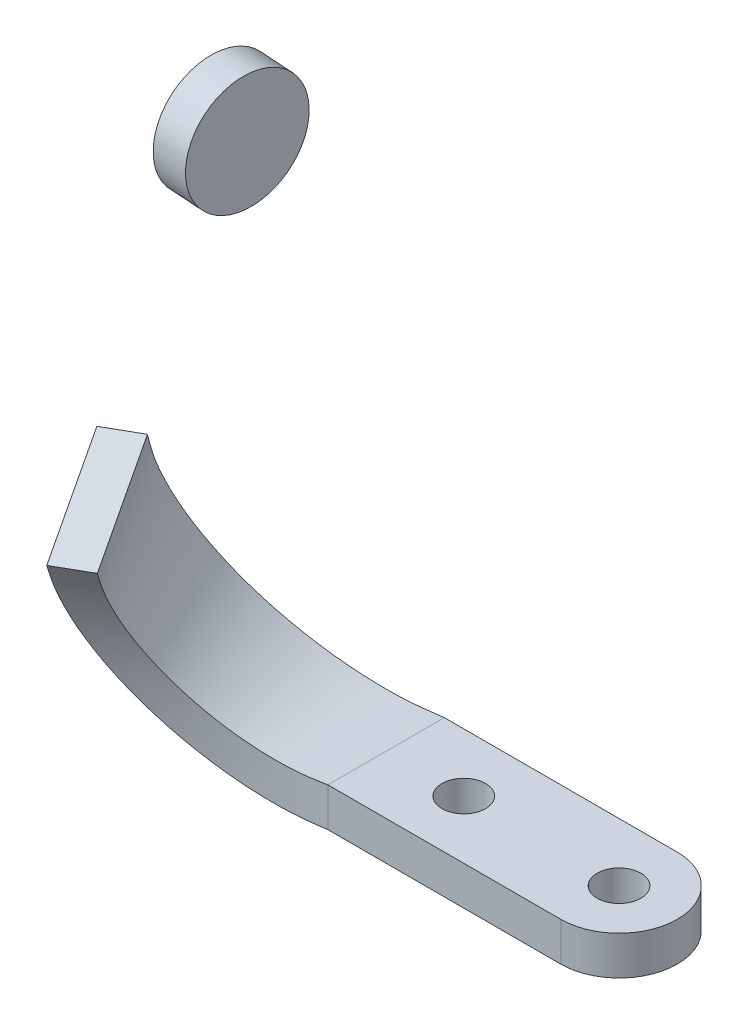
ISO-10303-21;
HEADER;
FILE_DESCRIPTION(('STEP AP214'),'2;1');
FILE_NAME('part.step','',(''),(''),'','','');
FILE_SCHEMA(('AUTOMOTIVE_DESIGN { 1 0 10303 214 1 1 1 1 }'));
ENDSEC;
DATA;
#1=APPLICATION_CONTEXT('core data for automotive mechanical design processes');
#2=APPLICATION_PROTOCOL_DEFINITION('international standard','automotive_design',2000,#1);
#3=PRODUCT_CONTEXT('',#1,'mechanical');
#4=PRODUCT('Part','Part','',(#3));
#5=PRODUCT_RELATED_PRODUCT_CATEGORY('part','',(#4));
#6=PRODUCT_DEFINITION_FORMATION('','',#4);
#7=PRODUCT_DEFINITION_CONTEXT('part definition',#1,'design');
#8=PRODUCT_DEFINITION('design','',#6,#7);
#9=PRODUCT_DEFINITION_SHAPE('','',#8);
#10=(LENGTH_UNIT() NAMED_UNIT(*) SI_UNIT(.MILLI.,.METRE.));
#11=(NAMED_UNIT(*) PLANE_ANGLE_UNIT() SI_UNIT($,.RADIAN.));
#12=(NAMED_UNIT(*) SI_UNIT($,.STERADIAN.) SOLID_ANGLE_UNIT());
#13=UNCERTAINTY_MEASURE_WITH_UNIT(LENGTH_MEASURE(1.E-05),#10,'distance_accuracy_value','');
#14=(GEOMETRIC_REPRESENTATION_CONTEXT(3) GLOBAL_UNCERTAINTY_ASSIGNED_CONTEXT((#13)) GLOBAL_UNIT_ASSIGNED_CONTEXT((#10,
#11,#12)) REPRESENTATION_CONTEXT('',''));
#15=CARTESIAN_POINT('',(0.,0.,0.));
#16=DIRECTION('',(0.,0.,1.));
#17=DIRECTION('',(1.,0.,0.));
#18=AXIS2_PLACEMENT_3D('',#15,#16,#17);
#19=CARTESIAN_POINT('',(16.9894171339197,88.6332155155401,-5.81435054927927));
#20=DIRECTION('',(0.997979380825055,0.,0.0635386138347371));
#21=DIRECTION('',(0.0635386138347371,0.,-0.997979380825055));
#22=AXIS2_PLACEMENT_3D('',#19,#20,#21);
#23=CYLINDRICAL_SURFACE('',#22,9.52500000652872);
#24=CARTESIAN_POINT('',(16.9894171339197,88.6332155155401,-5.81435054927927));
#25=DIRECTION('',(0.997979380825055,0.,0.0635386138347371));
#26=DIRECTION('',(0.0635386138347371,0.,-0.997979380825055));
#27=AXIS2_PLACEMENT_3D('',#24,#25,#26);
#28=CIRCLE('',#27,9.52500000652872);
#29=CARTESIAN_POINT('',(17.5946224311104,88.6332155155401,-15.3201041581534));
#30=VERTEX_POINT('',#29);
#31=EDGE_CURVE('E12',#30,#30,#28,.T.);
#32=ORIENTED_EDGE('',*,*,#31,.T.);
#33=EDGE_LOOP('',(#32));
#34=FACE_BOUND('',#33,.T.);
#35=CARTESIAN_POINT('',(22.6418391582322,88.6332155155401,-5.45447632027782));
#36=DIRECTION('',(0.997979380825055,0.,0.0635386138347371));
#37=DIRECTION('',(0.0635386138347371,0.,-0.997979380825055));
#38=AXIS2_PLACEMENT_3D('',#35,#36,#37);
#39=CIRCLE('',#38,9.52500000652872);
#40=CARTESIAN_POINT('',(23.2470444554229,88.6332155155401,-14.960229929152));
#41=VERTEX_POINT('',#40);
#42=EDGE_CURVE('E846',#41,#41,#39,.T.);
#43=ORIENTED_EDGE('',*,*,#42,.F.);
#44=EDGE_LOOP('',(#43));
#45=FACE_BOUND('',#44,.T.);
#46=ADVANCED_FACE('F843',(#34,#45),#23,.T.);
#47=CARTESIAN_POINT('',(16.552138930737,0.,1.05382935145369));
#48=DIRECTION('',(0.997979380825055,0.,0.0635386138347371));
#49=DIRECTION('',(0.0635386138347371,0.,-0.997979380825055));
#50=AXIS2_PLACEMENT_3D('',#47,#48,#49);
#51=PLANE('',#50);
#52=ORIENTED_EDGE('',*,*,#31,.F.);
#53=EDGE_LOOP('',(#52));
#54=FACE_BOUND('',#53,.T.);
#55=ADVANCED_FACE('F858',(#54),#51,.F.);
#56=CARTESIAN_POINT('',(22.2045609550496,0.,1.41370358045514));
#57=DIRECTION('',(0.997979380825055,0.,0.0635386138347371));
#58=DIRECTION('',(0.0635386138347371,0.,-0.997979380825055));
#59=AXIS2_PLACEMENT_3D('',#56,#57,#58);
#60=PLANE('',#59);
#61=ORIENTED_EDGE('',*,*,#42,.T.);
#62=EDGE_LOOP('',(#61));
#63=FACE_BOUND('',#62,.T.);
#64=ADVANCED_FACE('F855',(#63),#60,.T.);
#65=CLOSED_SHELL('',(#46,#55,#64));
#66=MANIFOLD_SOLID_BREP('B2',#65);
#67=CARTESIAN_POINT('',(88.9,19.05,0.));
#68=DIRECTION('',(0.,-1.,0.));
#69=DIRECTION('',(0.,0.,-1.));
#70=AXIS2_PLACEMENT_3D('',#67,#68,#69);
#71=CYLINDRICAL_SURFACE('',#70,9.52500000000001);
#72=CARTESIAN_POINT('',(88.9,12.7,0.));
#73=DIRECTION('',(0.,1.,0.));
#74=DIRECTION('',(0.,0.,1.));
#75=AXIS2_PLACEMENT_3D('',#72,#73,#74);
#76=CIRCLE('',#75,9.52500000000001);
#77=CARTESIAN_POINT('',(88.9,12.7,9.52499999999984));
#78=VERTEX_POINT('',#77);
#79=CARTESIAN_POINT('',(88.9,12.7,-9.52500000000292));
#80=VERTEX_POINT('',#79);
#81=EDGE_CURVE('E953',#78,#80,#76,.T.);
#82=ORIENTED_EDGE('',*,*,#81,.T.);
#83=DIRECTION('',(0.,-1.,0.));
#84=VECTOR('',#83,1.);
#85=CARTESIAN_POINT('',(88.9,19.05,-9.52500000000292));
#86=LINE('',#85,#84);
#87=CARTESIAN_POINT('',(88.9,19.05,-9.52500000000292));
#88=VERTEX_POINT('',#87);
#89=EDGE_CURVE('E841',#88,#80,#86,.T.);
#90=ORIENTED_EDGE('',*,*,#89,.F.);
#91=CARTESIAN_POINT('',(88.9,19.05,0.));
#92=DIRECTION('',(0.,1.,0.));
#93=DIRECTION('',(0.,0.,1.));
#94=AXIS2_PLACEMENT_3D('',#91,#92,#93);
#95=CIRCLE('',#94,9.52500000000001);
#96=CARTESIAN_POINT('',(88.9,19.05,9.52499999999984));
#97=VERTEX_POINT('',#96);
#98=EDGE_CURVE('E924',#97,#88,#95,.T.);
#99=ORIENTED_EDGE('',*,*,#98,.F.);
#100=DIRECTION('',(0.,-1.,0.));
#101=VECTOR('',#100,1.);
#102=CARTESIAN_POINT('',(88.9,19.05,9.52499999999984));
#103=LINE('',#102,#101);
#104=EDGE_CURVE('E1122',#97,#78,#103,.T.);
#105=ORIENTED_EDGE('',*,*,#104,.T.);
#106=EDGE_LOOP('',(#82,#90,#99,#105));
#107=FACE_BOUND('',#106,.T.);
#108=ADVANCED_FACE('F884',(#107),#71,.T.);
#109=CARTESIAN_POINT('',(0.,19.05,-9.52500000000583));
#110=DIRECTION('',(0.,0.,-1.));
#111=DIRECTION('',(-1.,0.,0.));
#112=AXIS2_PLACEMENT_3D('',#109,#110,#111);
#113=PLANE('',#112);
#114=DIRECTION('',(1.,0.,0.));
#115=VECTOR('',#114,1.);
#116=CARTESIAN_POINT('',(0.,12.7,-9.52500000000583));
#117=LINE('',#116,#115);
#118=CARTESIAN_POINT('',(50.8,12.7,-9.52500000000583));
#119=VERTEX_POINT('',#118);
#120=EDGE_CURVE('E943',#119,#80,#117,.T.);
#121=ORIENTED_EDGE('',*,*,#120,.F.);
#122=CARTESIAN_POINT('',(50.8,19.05,-9.52500000000583));
#123=CARTESIAN_POINT('',(50.8,12.7,-9.52500000000583));
#124=B_SPLINE_CURVE_WITH_KNOTS('',1,(#122,#123),.UNSPECIFIED.,.F.,.F.,(2,2),(0.,1.),.UNSPECIFIED.);
#125=CARTESIAN_POINT('',(50.8,19.05,-9.52500000000583));
#126=VERTEX_POINT('',#125);
#127=EDGE_CURVE('E893',#126,#119,#124,.T.);
#128=ORIENTED_EDGE('',*,*,#127,.F.);
#129=DIRECTION('',(1.,0.,0.));
#130=VECTOR('',#129,1.);
#131=CARTESIAN_POINT('',(0.,19.05,-9.52500000000583));
#132=LINE('',#131,#130);
#133=EDGE_CURVE('E1135',#126,#88,#132,.T.);
#134=ORIENTED_EDGE('',*,*,#133,.T.);
#135=ORIENTED_EDGE('',*,*,#89,.T.);
#136=EDGE_LOOP('',(#121,#128,#134,#135));
#137=FACE_BOUND('',#136,.T.);
#138=ADVANCED_FACE('F945',(#137),#113,.T.);
#139=CARTESIAN_POINT('',(0.,19.05,9.52499999999967));
#140=DIRECTION('',(0.,0.,-1.));
#141=DIRECTION('',(-1.,0.,0.));
#142=AXIS2_PLACEMENT_3D('',#139,#140,#141);
#143=PLANE('',#142);
#144=DIRECTION('',(1.,0.,0.));
#145=VECTOR('',#144,1.);
#146=CARTESIAN_POINT('',(0.,12.7,9.52499999999967));
#147=LINE('',#146,#145);
#148=CARTESIAN_POINT('',(50.8,12.7,9.52499999999967));
#149=VERTEX_POINT('',#148);
#150=EDGE_CURVE('E919',#149,#78,#147,.T.);
#151=ORIENTED_EDGE('',*,*,#150,.T.);
#152=ORIENTED_EDGE('',*,*,#104,.F.);
#153=DIRECTION('',(1.,0.,0.));
#154=VECTOR('',#153,1.);
#155=CARTESIAN_POINT('',(0.,19.05,9.52499999999967));
#156=LINE('',#155,#154);
#157=CARTESIAN_POINT('',(50.8,19.05,9.52499999999967));
#158=VERTEX_POINT('',#157);
#159=EDGE_CURVE('E902',#158,#97,#156,.T.);
#160=ORIENTED_EDGE('',*,*,#159,.F.);
#161=CARTESIAN_POINT('',(50.8,12.7,9.52499999999967));
#162=CARTESIAN_POINT('',(50.8,19.05,9.52499999999967));
#163=B_SPLINE_CURVE_WITH_KNOTS('',1,(#161,#162),.UNSPECIFIED.,.F.,.F.,(2,2),(0.,1.),.UNSPECIFIED.);
#164=EDGE_CURVE('E915',#158,#149,#163,.F.);
#165=ORIENTED_EDGE('',*,*,#164,.T.);
#166=EDGE_LOOP('',(#151,#152,#160,#165));
#167=FACE_BOUND('',#166,.T.);
#168=ADVANCED_FACE('F1121',(#167),#143,.F.);
#169=CARTESIAN_POINT('',(0.,19.05,0.));
#170=DIRECTION('',(0.,1.,0.));
#171=DIRECTION('',(0.,0.,1.));
#172=AXIS2_PLACEMENT_3D('',#169,#170,#171);
#173=PLANE('',#172);
#174=CARTESIAN_POINT('',(88.9,19.05,0.));
#175=DIRECTION('',(0.,1.,0.));
#176=DIRECTION('',(0.,0.,1.));
#177=AXIS2_PLACEMENT_3D('',#174,#175,#176);
#178=CIRCLE('',#177,3.57123999999999);
#179=CARTESIAN_POINT('',(88.9,19.05,3.57123999999999));
#180=VERTEX_POINT('',#179);
#181=EDGE_CURVE('E1183',#180,#180,#178,.T.);
#182=ORIENTED_EDGE('',*,*,#181,.F.);
#183=EDGE_LOOP('',(#182));
#184=FACE_BOUND('',#183,.T.);
#185=CARTESIAN_POINT('',(63.5,19.05,0.));
#186=DIRECTION('',(0.,1.,0.));
#187=DIRECTION('',(0.,0.,1.));
#188=AXIS2_PLACEMENT_3D('',#185,#186,#187);
#189=CIRCLE('',#188,3.57123999999999);
#190=CARTESIAN_POINT('',(63.5,19.05,3.57123999999999));
#191=VERTEX_POINT('',#190);
#192=EDGE_CURVE('E1186',#191,#191,#189,.T.);
#193=ORIENTED_EDGE('',*,*,#192,.F.);
#194=EDGE_LOOP('',(#193));
#195=FACE_BOUND('',#194,.T.);
#196=ORIENTED_EDGE('',*,*,#98,.T.);
#197=ORIENTED_EDGE('',*,*,#133,.F.);
#198=CARTESIAN_POINT('',(50.8,19.05,9.52499999999967));
#199=CARTESIAN_POINT('',(50.8,19.05,-9.52500000000583));
#200=B_SPLINE_CURVE_WITH_KNOTS('',1,(#198,#199),.UNSPECIFIED.,.F.,.F.,(2,2),(0.,1.),.UNSPECIFIED.);
#201=EDGE_CURVE('E1160',#126,#158,#200,.F.);
#202=ORIENTED_EDGE('',*,*,#201,.T.);
#203=ORIENTED_EDGE('',*,*,#159,.T.);
#204=EDGE_LOOP('',(#196,#197,#202,#203));
#205=FACE_BOUND('',#204,.T.);
#206=ADVANCED_FACE('F1147',(#184,#195,#205),#173,.T.);
#207=CARTESIAN_POINT('',(0.,12.7,0.));
#208=DIRECTION('',(0.,1.,0.));
#209=DIRECTION('',(0.,0.,1.));
#210=AXIS2_PLACEMENT_3D('',#207,#208,#209);
#211=PLANE('',#210);
#212=CARTESIAN_POINT('',(88.9,12.7,0.));
#213=DIRECTION('',(0.,1.,0.));
#214=DIRECTION('',(0.,0.,1.));
#215=AXIS2_PLACEMENT_3D('',#212,#213,#214);
#216=CIRCLE('',#215,3.57124);
#217=CARTESIAN_POINT('',(88.9,12.7,3.57124));
#218=VERTEX_POINT('',#217);
#219=EDGE_CURVE('E887',#218,#218,#216,.T.);
#220=ORIENTED_EDGE('',*,*,#219,.T.);
#221=EDGE_LOOP('',(#220));
#222=FACE_BOUND('',#221,.T.);
#223=CARTESIAN_POINT('',(63.5,12.7,0.));
#224=DIRECTION('',(0.,1.,0.));
#225=DIRECTION('',(0.,0.,1.));
#226=AXIS2_PLACEMENT_3D('',#223,#224,#225);
#227=CIRCLE('',#226,3.57124);
#228=CARTESIAN_POINT('',(63.5,12.7,3.57124));
#229=VERTEX_POINT('',#228);
#230=EDGE_CURVE('E984',#229,#229,#227,.T.);
#231=ORIENTED_EDGE('',*,*,#230,.T.);
#232=EDGE_LOOP('',(#231));
#233=FACE_BOUND('',#232,.T.);
#234=ORIENTED_EDGE('',*,*,#81,.F.);
#235=ORIENTED_EDGE('',*,*,#150,.F.);
#236=CARTESIAN_POINT('',(50.8,12.7,-9.52500000000583));
#237=CARTESIAN_POINT('',(50.8,12.7,9.52499999999966));
#238=B_SPLINE_CURVE_WITH_KNOTS('',1,(#236,#237),.UNSPECIFIED.,.F.,.F.,(2,2),(0.,1.),.UNSPECIFIED.);
#239=EDGE_CURVE('E952',#119,#149,#238,.T.);
#240=ORIENTED_EDGE('',*,*,#239,.F.);
#241=ORIENTED_EDGE('',*,*,#120,.T.);
#242=EDGE_LOOP('',(#234,#235,#240,#241));
#243=FACE_BOUND('',#242,.T.);
#244=ADVANCED_FACE('F957',(#222,#233,#243),#211,.F.);
#245=CARTESIAN_POINT('',(4.85127975059303,45.5184740512119,22.0266566875373));
#246=DIRECTION('',(-0.0954976328856896,-0.896032953764014,-0.433595604085381));
#247=DIRECTION('',(0.,0.435586383245858,-0.900146933967334));
#248=AXIS2_PLACEMENT_3D('',#245,#246,#247);
#249=PLANE('',#248);
#250=DIRECTION('',(0.918313956509871,0.0888011415247013,-0.385763962214068));
#251=VECTOR('',#250,1.);
#252=CARTESIAN_POINT('',(12.8547334016457,50.7897801434607,9.37068233052512));
#253=LINE('',#252,#251);
#254=CARTESIAN_POINT('',(12.8547334016457,50.7897801434607,9.37068233052512));
#255=VERTEX_POINT('',#254);
#256=CARTESIAN_POINT('',(18.6860270254832,51.3536673921426,6.92108117046585));
#257=VERTEX_POINT('',#256);
#258=EDGE_CURVE('E1065',#255,#257,#253,.T.);
#259=ORIENTED_EDGE('',*,*,#258,.F.);
#260=DIRECTION('',(-0.384161007121255,0.435016439956982,-0.814359268121102));
#261=VECTOR('',#260,1.);
#262=CARTESIAN_POINT('',(20.1730005873049,42.502716962281,24.8842263882307));
#263=LINE('',#262,#261);
#264=CARTESIAN_POINT('',(20.1730005873049,42.502716962281,24.8842263882307));
#265=VERTEX_POINT('',#264);
#266=EDGE_CURVE('E977',#265,#255,#263,.T.);
#267=ORIENTED_EDGE('',*,*,#266,.F.);
#268=DIRECTION('',(-0.918313956509871,-0.0888011415247013,0.385763962214068));
#269=VECTOR('',#268,1.);
#270=CARTESIAN_POINT('',(26.0042942111424,43.0666042109628,22.4346252281714));
#271=LINE('',#270,#269);
#272=CARTESIAN_POINT('',(26.0042942111424,43.0666042109628,22.4346252281714));
#273=VERTEX_POINT('',#272);
#274=EDGE_CURVE('E1124',#273,#265,#271,.T.);
#275=ORIENTED_EDGE('',*,*,#274,.F.);
#276=DIRECTION('',(0.384161007121255,-0.435016439956982,0.814359268121102));
#277=VECTOR('',#276,1.);
#278=CARTESIAN_POINT('',(18.6860270254832,51.3536673921426,6.92108117046585));
#279=LINE('',#278,#277);
#280=EDGE_CURVE('E1055',#257,#273,#279,.T.);
#281=ORIENTED_EDGE('',*,*,#280,.F.);
#282=EDGE_LOOP('',(#259,#267,#275,#281));
#283=FACE_BOUND('',#282,.T.);
#284=ADVANCED_FACE('F1031',(#283),#249,.F.);
#285=CARTESIAN_POINT('',(50.8,19.05,-9.52500000000583));
#286=CARTESIAN_POINT('',(48.6764679004341,18.8270198042164,-9.47003227948879));
#287=CARTESIAN_POINT('',(46.5142592496347,18.5999784007082,-9.41406341476527));
#288=CARTESIAN_POINT('',(42.295168616202,18.7959857339652,-9.02470316638206));
#289=CARTESIAN_POINT('',(40.1199173440498,19.1148300114105,-8.72849975310569));
#290=CARTESIAN_POINT('',(36.1210399634811,20.1343501794318,-7.9941158781304));
#291=CARTESIAN_POINT('',(34.0584385002922,20.8989937924323,-7.51071973163778));
#292=CARTESIAN_POINT('',(30.4715339995244,22.6841420998788,-6.47067745982872));
#293=CARTESIAN_POINT('',(28.6280366192028,23.8609511459464,-5.8225991988573));
#294=CARTESIAN_POINT('',(25.5779871555473,26.3208466313887,-4.52589147434957));
#295=CARTESIAN_POINT('',(24.0513152239653,27.8719787022671,-3.73685099112596));
#296=CARTESIAN_POINT('',(21.6984119447902,30.8987731807177,-2.24245270630172));
#297=CARTESIAN_POINT('',(20.6141385291824,32.6930549187211,-1.37903926941898));
#298=CARTESIAN_POINT('',(19.0500434143653,36.1242394651813,0.235116080145241));
#299=CARTESIAN_POINT('',(18.4335930796218,38.0656173648419,1.1289349519149));
#300=CARTESIAN_POINT('',(17.7337206077166,41.7737357968574,2.80142726037601));
#301=CARTESIAN_POINT('',(17.6051549340738,43.7627372358164,3.6805773408291));
#302=CARTESIAN_POINT('',(17.802523252176,47.5685433787836,5.33041256803814));
#303=CARTESIAN_POINT('',(18.2482616673204,49.4781845481972,6.13292425308963));
#304=CARTESIAN_POINT('',(18.6860270254832,51.3536673921426,6.92108117046585));
#305=CARTESIAN_POINT('',(50.8,12.7,-9.52500000000583));
#306=CARTESIAN_POINT('',(48.3298333045786,12.5024975138079,-9.45238639790396));
#307=CARTESIAN_POINT('',(45.8146766941141,12.3013978533478,-9.37845026166072));
#308=CARTESIAN_POINT('',(40.9321169013523,12.6266125653853,-8.92156222545437));
#309=CARTESIAN_POINT('',(38.4187476001967,13.0386689541349,-8.57937697428099));
#310=CARTESIAN_POINT('',(33.7840371808487,14.2912271987008,-7.73361801884925));
#311=CARTESIAN_POINT('',(31.3894215859284,15.2097740573024,-7.17841641567264));
#312=CARTESIAN_POINT('',(27.2349977367695,17.3178580833571,-5.9922271298844));
#313=CARTESIAN_POINT('',(25.0984935204321,18.694640940993,-5.25532791663739));
#314=CARTESIAN_POINT('',(21.5437998356678,21.5663357160551,-3.77810089640026));
#315=CARTESIAN_POINT('',(19.7488279328755,23.3789933644965,-2.87540172581862));
#316=CARTESIAN_POINT('',(16.9752561269957,26.8966131580372,-1.17196263889585));
#317=CARTESIAN_POINT('',(15.6878148580914,28.9755227312578,-0.189166987003747));
#318=CARTESIAN_POINT('',(13.7993913803686,32.958273310747,1.65363340328174));
#319=CARTESIAN_POINT('',(13.0310577177415,35.2224026026793,2.68014567228495));
#320=CARTESIAN_POINT('',(12.1080447439379,39.5492839409508,4.60302121346085));
#321=CARTESIAN_POINT('',(11.894488004861,41.8678160420272,5.61329704466007));
#322=CARTESIAN_POINT('',(11.985886579139,46.32111700881,7.51722413926997));
#323=CARTESIAN_POINT('',(12.4242303840757,48.5756119907583,8.45231637279148));
#324=CARTESIAN_POINT('',(12.8547334016457,50.7897801434607,9.37068233052512));
#325=B_SPLINE_SURFACE_WITH_KNOTS('',1,3,((#285,#286,#287,#288,#289,#290,#291,#292,#293,#294,
#295,#296,#297,#298,#299,#300,#301,#302,#303,#304),(#305,#306,#307,#308,#309,#310,#311,#312,
#313,#314,#315,#316,#317,#318,#319,#320,#321,#322,#323,#324)),.UNSPECIFIED.,.F.,.F.,.F.,(2,2),
(4,1,1,1,1,1,1,1,1,1,1,1,1,1,1,1,1,4),(0.,1.),(0.,0.109997579268962,0.112000999424955,
0.21997852152269,0.223984937052312,0.329972280146951,0.335982495532029,0.439986358739459,
0.447999544387879,0.551991786569402,0.560005003433478,0.664009653249479,0.670019938150436,
0.77600897489634,0.780015457647544,0.887994946017158,0.889998414076662,1.),.UNSPECIFIED.);
#326=CARTESIAN_POINT('',(50.8,12.7,-9.52500000000583));
#327=CARTESIAN_POINT('',(48.3298333045786,12.5024975138079,-9.45238639790396));
#328=CARTESIAN_POINT('',(45.8146766941141,12.3013978533478,-9.37845026166072));
#329=CARTESIAN_POINT('',(40.9321169013523,12.6266125653853,-8.92156222545437));
#330=CARTESIAN_POINT('',(38.4187476001967,13.0386689541349,-8.57937697428099));
#331=CARTESIAN_POINT('',(33.7840371808487,14.2912271987008,-7.73361801884925));
#332=CARTESIAN_POINT('',(31.3894215859284,15.2097740573024,-7.17841641567264));
#333=CARTESIAN_POINT('',(27.2349977367695,17.3178580833571,-5.9922271298844));
#334=CARTESIAN_POINT('',(25.0984935204321,18.694640940993,-5.25532791663739));
#335=CARTESIAN_POINT('',(21.5437998356678,21.5663357160551,-3.77810089640026));
#336=CARTESIAN_POINT('',(19.7488279328755,23.3789933644965,-2.87540172581862));
#337=CARTESIAN_POINT('',(16.9752561269957,26.8966131580372,-1.17196263889585));
#338=CARTESIAN_POINT('',(15.6878148580914,28.9755227312578,-0.189166987003747));
#339=CARTESIAN_POINT('',(13.7993913803686,32.958273310747,1.65363340328174));
#340=CARTESIAN_POINT('',(13.0310577177415,35.2224026026793,2.68014567228495));
#341=CARTESIAN_POINT('',(12.1080447439379,39.5492839409508,4.60302121346085));
#342=CARTESIAN_POINT('',(11.894488004861,41.8678160420272,5.61329704466007));
#343=CARTESIAN_POINT('',(11.985886579139,46.32111700881,7.51722413926997));
#344=CARTESIAN_POINT('',(12.4242303840757,48.5756119907583,8.45231637279148));
#345=CARTESIAN_POINT('',(12.8547334016457,50.7897801434607,9.37068233052512));
#346=B_SPLINE_CURVE_WITH_KNOTS('',3,(#326,#327,#328,#329,#330,#331,#332,#333,#334,#335,#336,
#337,#338,#339,#340,#341,#342,#343,#344,#345),.UNSPECIFIED.,.F.,.F.,(4,1,1,1,1,1,1,1,1,1,1,1,1,
1,1,1,1,4),(0.,0.109997579268962,0.112000999424955,0.21997852152269,0.223984937052312,
0.329972280146951,0.335982495532029,0.439986358739459,0.447999544387879,0.551991786569402,
0.560005003433478,0.664009653249479,0.670019938150436,0.77600897489634,0.780015457647544,
0.887994946017158,0.889998414076662,1.),.UNSPECIFIED.);
#347=EDGE_CURVE('E970',#119,#255,#346,.T.);
#348=CARTESIAN_POINT('',(50.8,19.05,-9.52500000000583));
#349=CARTESIAN_POINT('',(48.6764679004341,18.8270198042164,-9.47003227948879));
#350=CARTESIAN_POINT('',(46.5142592496347,18.5999784007082,-9.41406341476527));
#351=CARTESIAN_POINT('',(42.295168616202,18.7959857339652,-9.02470316638206));
#352=CARTESIAN_POINT('',(40.1199173440498,19.1148300114105,-8.72849975310569));
#353=CARTESIAN_POINT('',(36.1210399634811,20.1343501794318,-7.9941158781304));
#354=CARTESIAN_POINT('',(34.0584385002922,20.8989937924323,-7.51071973163778));
#355=CARTESIAN_POINT('',(30.4715339995244,22.6841420998788,-6.47067745982872));
#356=CARTESIAN_POINT('',(28.6280366192028,23.8609511459464,-5.8225991988573));
#357=CARTESIAN_POINT('',(25.5779871555473,26.3208466313887,-4.52589147434957));
#358=CARTESIAN_POINT('',(24.0513152239653,27.8719787022671,-3.73685099112596));
#359=CARTESIAN_POINT('',(21.6984119447902,30.8987731807177,-2.24245270630172));
#360=CARTESIAN_POINT('',(20.6141385291824,32.6930549187211,-1.37903926941898));
#361=CARTESIAN_POINT('',(19.0500434143653,36.1242394651813,0.235116080145241));
#362=CARTESIAN_POINT('',(18.4335930796218,38.0656173648419,1.1289349519149));
#363=CARTESIAN_POINT('',(17.7337206077166,41.7737357968574,2.80142726037601));
#364=CARTESIAN_POINT('',(17.6051549340738,43.7627372358164,3.6805773408291));
#365=CARTESIAN_POINT('',(17.802523252176,47.5685433787836,5.33041256803814));
#366=CARTESIAN_POINT('',(18.2482616673204,49.4781845481972,6.13292425308963));
#367=CARTESIAN_POINT('',(18.6860270254832,51.3536673921426,6.92108117046585));
#368=B_SPLINE_CURVE_WITH_KNOTS('',3,(#348,#349,#350,#351,#352,#353,#354,#355,#356,#357,#358,
#359,#360,#361,#362,#363,#364,#365,#366,#367),.UNSPECIFIED.,.F.,.F.,(4,1,1,1,1,1,1,1,1,1,1,1,1,
1,1,1,1,4),(0.,0.109997579268962,0.112000999424955,0.21997852152269,0.223984937052312,
0.329972280146951,0.335982495532029,0.439986358739459,0.447999544387879,0.551991786569402,
0.560005003433478,0.664009653249479,0.670019938150436,0.77600897489634,0.780015457647544,
0.887994946017158,0.889998414076662,1.),.UNSPECIFIED.);
#369=EDGE_CURVE('E973',#257,#126,#368,.F.);
#370=ORIENTED_EDGE('',*,*,#127,.T.);
#371=ORIENTED_EDGE('',*,*,#347,.T.);
#372=ORIENTED_EDGE('',*,*,#258,.T.);
#373=ORIENTED_EDGE('',*,*,#369,.T.);
#374=EDGE_LOOP('',(#370,#371,#372,#373));
#375=FACE_BOUND('',#374,.T.);
#376=ADVANCED_FACE('F968',(#375),#325,.T.);
#377=CARTESIAN_POINT('',(50.8,12.7,-9.52500000000583));
#378=CARTESIAN_POINT('',(48.3298333045786,12.5024975138079,-9.45238639790396));
#379=CARTESIAN_POINT('',(45.8146766941141,12.3013978533478,-9.37845026166072));
#380=CARTESIAN_POINT('',(40.9321169013523,12.6266125653853,-8.92156222545437));
#381=CARTESIAN_POINT('',(38.4187476001967,13.0386689541349,-8.57937697428099));
#382=CARTESIAN_POINT('',(33.7840371808487,14.2912271987008,-7.73361801884925));
#383=CARTESIAN_POINT('',(31.3894215859284,15.2097740573024,-7.17841641567264));
#384=CARTESIAN_POINT('',(27.2349977367695,17.3178580833571,-5.9922271298844));
#385=CARTESIAN_POINT('',(25.0984935204321,18.694640940993,-5.25532791663739));
#386=CARTESIAN_POINT('',(21.5437998356678,21.5663357160551,-3.77810089640026));
#387=CARTESIAN_POINT('',(19.7488279328755,23.3789933644965,-2.87540172581862));
#388=CARTESIAN_POINT('',(16.9752561269957,26.8966131580372,-1.17196263889585));
#389=CARTESIAN_POINT('',(15.6878148580914,28.9755227312578,-0.189166987003747));
#390=CARTESIAN_POINT('',(13.7993913803686,32.958273310747,1.65363340328174));
#391=CARTESIAN_POINT('',(13.0310577177415,35.2224026026793,2.68014567228495));
#392=CARTESIAN_POINT('',(12.1080447439379,39.5492839409508,4.60302121346085));
#393=CARTESIAN_POINT('',(11.8944880048611,41.8678160420272,5.61329704466005));
#394=CARTESIAN_POINT('',(11.985886579139,46.32111700881,7.51722413926999));
#395=CARTESIAN_POINT('',(12.4242303840757,48.5756119907583,8.45231637279148));
#396=CARTESIAN_POINT('',(12.8547334016457,50.7897801434607,9.37068233052512));
#397=CARTESIAN_POINT('',(50.8,12.7,9.52499999999966));
#398=CARTESIAN_POINT('',(48.8852656642382,12.5085134292961,9.58287860655542));
#399=CARTESIAN_POINT('',(46.9356576759184,12.3135392540657,9.64181137419132));
#400=CARTESIAN_POINT('',(43.1108536752891,12.489139616953,10.0021080815373));
#401=CARTESIAN_POINT('',(41.1317281327004,12.7707745759384,10.2721960459137));
#402=CARTESIAN_POINT('',(37.479448307968,13.6744178299444,10.9390600304606));
#403=CARTESIAN_POINT('',(35.5865805385033,14.352875267667,11.3768714555755));
#404=CARTESIAN_POINT('',(32.2666798062365,15.9443971264473,12.3210336380437));
#405=CARTESIAN_POINT('',(30.5463939596746,16.9971480367936,12.910394435847));
#406=CARTESIAN_POINT('',(27.6739886273437,19.208311059154,14.0935806768171));
#407=CARTESIAN_POINT('',(26.2204223435221,20.6072760818846,14.8153145872084));
#408=CARTESIAN_POINT('',(23.9421973441089,23.3562627590617,16.1909545949354));
#409=CARTESIAN_POINT('',(22.8696378514843,24.9951810448322,16.9900584245706));
#410=CARTESIAN_POINT('',(21.2771300717167,28.1489499254001,18.4931467448092));
#411=CARTESIAN_POINT('',(20.6176319643017,29.9429782760049,19.330086092243));
#412=CARTESIAN_POINT('',(19.7903956242896,33.3971049206176,20.9090773285312));
#413=CARTESIAN_POINT('',(19.570707176032,35.2646957965657,21.7461486103409));
#414=CARTESIAN_POINT('',(19.5563886869189,38.8686190915008,23.3315578614457));
#415=CARTESIAN_POINT('',(19.8674769013002,40.7020657324106,24.1148980454758));
#416=CARTESIAN_POINT('',(20.1730005873049,42.502716962281,24.8842263882307));
#417=B_SPLINE_SURFACE_WITH_KNOTS('',1,3,((#377,#378,#379,#380,#381,#382,#383,#384,#385,#386,
#387,#388,#389,#390,#391,#392,#393,#394,#395,#396),(#397,#398,#399,#400,#401,#402,#403,#404,
#405,#406,#407,#408,#409,#410,#411,#412,#413,#414,#415,#416)),.UNSPECIFIED.,.F.,.F.,.F.,(2,2),
(4,1,1,1,1,1,1,1,1,1,1,1,1,1,1,1,1,4),(0.,1.),(0.,0.109997579268962,0.112000999424955,
0.21997852152269,0.223984937052312,0.329972280146951,0.335982495532029,0.439986358739459,
0.447999544387879,0.551991786569402,0.560005003433478,0.664009653249479,0.670019938150436,
0.77600897489634,0.780015457647544,0.887994946017158,0.889998414076662,1.),.UNSPECIFIED.);
#418=CARTESIAN_POINT('',(50.8,12.7,9.52499999999966));
#419=CARTESIAN_POINT('',(48.8852656642382,12.5085134292961,9.58287860655542));
#420=CARTESIAN_POINT('',(46.9356576759184,12.3135392540657,9.64181137419132));
#421=CARTESIAN_POINT('',(43.1108536752891,12.489139616953,10.0021080815373));
#422=CARTESIAN_POINT('',(41.1317281327004,12.7707745759384,10.2721960459137));
#423=CARTESIAN_POINT('',(37.479448307968,13.6744178299444,10.9390600304606));
#424=CARTESIAN_POINT('',(35.5865805385033,14.352875267667,11.3768714555755));
#425=CARTESIAN_POINT('',(32.2666798062365,15.9443971264473,12.3210336380437));
#426=CARTESIAN_POINT('',(30.5463939596746,16.9971480367936,12.910394435847));
#427=CARTESIAN_POINT('',(27.6739886273437,19.208311059154,14.0935806768171));
#428=CARTESIAN_POINT('',(26.2204223435221,20.6072760818846,14.8153145872084));
#429=CARTESIAN_POINT('',(23.9421973441089,23.3562627590617,16.1909545949354));
#430=CARTESIAN_POINT('',(22.8696378514843,24.9951810448322,16.9900584245706));
#431=CARTESIAN_POINT('',(21.2771300717167,28.1489499254001,18.4931467448092));
#432=CARTESIAN_POINT('',(20.6176319643017,29.9429782760049,19.330086092243));
#433=CARTESIAN_POINT('',(19.7903956242896,33.3971049206176,20.9090773285312));
#434=CARTESIAN_POINT('',(19.570707176032,35.2646957965657,21.7461486103409));
#435=CARTESIAN_POINT('',(19.5563886869189,38.8686190915008,23.3315578614457));
#436=CARTESIAN_POINT('',(19.8674769013002,40.7020657324106,24.1148980454758));
#437=CARTESIAN_POINT('',(20.1730005873049,42.502716962281,24.8842263882307));
#438=B_SPLINE_CURVE_WITH_KNOTS('',3,(#418,#419,#420,#421,#422,#423,#424,#425,#426,#427,#428,
#429,#430,#431,#432,#433,#434,#435,#436,#437),.UNSPECIFIED.,.F.,.F.,(4,1,1,1,1,1,1,1,1,1,1,1,1,
1,1,1,1,4),(0.,0.109997579268962,0.112000999424955,0.21997852152269,0.223984937052312,
0.329972280146951,0.335982495532029,0.439986358739459,0.447999544387879,0.551991786569402,
0.560005003433478,0.664009653249479,0.670019938150436,0.77600897489634,0.780015457647544,
0.887994946017158,0.889998414076662,1.),.UNSPECIFIED.);
#439=EDGE_CURVE('E980',#149,#265,#438,.T.);
#440=ORIENTED_EDGE('',*,*,#239,.T.);
#441=ORIENTED_EDGE('',*,*,#439,.T.);
#442=ORIENTED_EDGE('',*,*,#266,.T.);
#443=ORIENTED_EDGE('',*,*,#347,.F.);
#444=EDGE_LOOP('',(#440,#441,#442,#443));
#445=FACE_BOUND('',#444,.T.);
#446=ADVANCED_FACE('F976',(#445),#417,.T.);
#447=CARTESIAN_POINT('',(50.8,19.05,9.52499999999967));
#448=CARTESIAN_POINT('',(49.2319002600935,18.8330357197046,9.56523272497055));
#449=CARTESIAN_POINT('',(47.6352402314386,18.6121198014262,9.60619822108668));
#450=CARTESIAN_POINT('',(44.4739053901392,18.6585127855328,9.89896714060975));
#451=CARTESIAN_POINT('',(42.8328978765534,18.8469356332139,10.123073267089));
#452=CARTESIAN_POINT('',(39.8164510906005,19.5175408106755,10.6785621711795));
#453=CARTESIAN_POINT('',(38.2555974528672,20.0420950027968,11.0445681396104));
#454=CARTESIAN_POINT('',(35.5032160689913,21.3106811429691,11.8425833080994));
#455=CARTESIAN_POINT('',(34.0759370584451,22.163458241747,12.343123153627));
#456=CARTESIAN_POINT('',(31.7081759472233,23.9628219744876,13.3457900988678));
#457=CARTESIAN_POINT('',(30.5229096346118,25.1002614196551,13.953865321901));
#458=CARTESIAN_POINT('',(28.6653531619034,27.3584227817422,15.1204645275295));
#459=CARTESIAN_POINT('',(27.7959615225753,28.7127132322955,15.8001861421555));
#460=CARTESIAN_POINT('',(26.5277821057133,31.3149160798343,17.0746294216726));
#461=CARTESIAN_POINT('',(26.0201673261819,32.7861930381676,17.7788753718727));
#462=CARTESIAN_POINT('',(25.4160714880684,35.6215567765242,19.1074833754466));
#463=CARTESIAN_POINT('',(25.2813741052449,37.1596169903547,19.8134289065101));
#464=CARTESIAN_POINT('',(25.3730253599557,40.1160454614746,21.1447462902137));
#465=CARTESIAN_POINT('',(25.6915081845448,41.6046382898496,21.7955059257739));
#466=CARTESIAN_POINT('',(26.0042942111424,43.0666042109628,22.4346252281714));
#467=CARTESIAN_POINT('',(50.8,19.05,-9.52500000000583));
#468=CARTESIAN_POINT('',(48.6764679004341,18.8270198042164,-9.47003227948886));
#469=CARTESIAN_POINT('',(46.5142592496347,18.5999784007082,-9.4140634147654));
#470=CARTESIAN_POINT('',(42.295168616202,18.7959857339652,-9.02470316638193));
#471=CARTESIAN_POINT('',(40.1199173440498,19.1148300114105,-8.72849975310564));
#472=CARTESIAN_POINT('',(36.1210399634811,20.1343501794318,-7.99411587813044));
#473=CARTESIAN_POINT('',(34.0584385002922,20.8989937924323,-7.51071973163781));
#474=CARTESIAN_POINT('',(30.4715339995244,22.6841420998788,-6.47067745982869));
#475=CARTESIAN_POINT('',(28.6280366192028,23.8609511459464,-5.82259919885729));
#476=CARTESIAN_POINT('',(25.5779871555473,26.3208466313887,-4.52589147434959));
#477=CARTESIAN_POINT('',(24.0513152239653,27.8719787022671,-3.73685099112596));
#478=CARTESIAN_POINT('',(21.6984119447902,30.8987731807177,-2.24245270630172));
#479=CARTESIAN_POINT('',(20.6141385291824,32.6930549187211,-1.37903926941894));
#480=CARTESIAN_POINT('',(19.0500434143653,36.1242394651813,0.23511608014521));
#481=CARTESIAN_POINT('',(18.4335930796218,38.0656173648419,1.12893495191489));
#482=CARTESIAN_POINT('',(17.7337206077165,41.7737357968574,2.801427260376));
#483=CARTESIAN_POINT('',(17.6051549340738,43.7627372358164,3.68057734082922));
#484=CARTESIAN_POINT('',(17.802523252176,47.5685433787836,5.330412568038));
#485=CARTESIAN_POINT('',(18.2482616673204,49.4781845481972,6.13292425308956));
#486=CARTESIAN_POINT('',(18.6860270254832,51.3536673921426,6.92108117046585));
#487=B_SPLINE_SURFACE_WITH_KNOTS('',1,3,((#447,#448,#449,#450,#451,#452,#453,#454,#455,#456,
#457,#458,#459,#460,#461,#462,#463,#464,#465,#466),(#467,#468,#469,#470,#471,#472,#473,#474,
#475,#476,#477,#478,#479,#480,#481,#482,#483,#484,#485,#486)),.UNSPECIFIED.,.F.,.F.,.F.,(2,2),
(4,1,1,1,1,1,1,1,1,1,1,1,1,1,1,1,1,4),(0.,1.),(0.,0.109997579268962,0.112000999424955,
0.21997852152269,0.223984937052312,0.329972280146951,0.335982495532029,0.439986358739459,
0.447999544387879,0.551991786569402,0.560005003433478,0.664009653249479,0.670019938150436,
0.77600897489634,0.780015457647544,0.887994946017158,0.889998414076662,1.),.UNSPECIFIED.);
#488=CARTESIAN_POINT('',(50.8,19.05,9.52499999999967));
#489=CARTESIAN_POINT('',(49.2319002600935,18.8330357197046,9.56523272497055));
#490=CARTESIAN_POINT('',(47.6352402314386,18.6121198014262,9.60619822108668));
#491=CARTESIAN_POINT('',(44.4739053901392,18.6585127855328,9.89896714060975));
#492=CARTESIAN_POINT('',(42.8328978765534,18.8469356332139,10.123073267089));
#493=CARTESIAN_POINT('',(39.8164510906005,19.5175408106755,10.6785621711795));
#494=CARTESIAN_POINT('',(38.2555974528672,20.0420950027969,11.0445681396104));
#495=CARTESIAN_POINT('',(35.5032160689913,21.3106811429691,11.8425833080994));
#496=CARTESIAN_POINT('',(34.0759370584451,22.163458241747,12.343123153627));
#497=CARTESIAN_POINT('',(31.7081759472233,23.9628219744876,13.3457900988678));
#498=CARTESIAN_POINT('',(30.5229096346118,25.1002614196551,13.953865321901));
#499=CARTESIAN_POINT('',(28.6653531619034,27.3584227817422,15.1204645275295));
#500=CARTESIAN_POINT('',(27.7959615225753,28.7127132322955,15.8001861421555));
#501=CARTESIAN_POINT('',(26.5277821057133,31.3149160798343,17.0746294216726));
#502=CARTESIAN_POINT('',(26.0201673261819,32.7861930381676,17.7788753718727));
#503=CARTESIAN_POINT('',(25.4160714880684,35.6215567765242,19.1074833754466));
#504=CARTESIAN_POINT('',(25.281374105245,37.1596169903547,19.81342890651));
#505=CARTESIAN_POINT('',(25.3730253599557,40.1160454614746,21.1447462902137));
#506=CARTESIAN_POINT('',(25.6915081845448,41.6046382898496,21.7955059257739));
#507=CARTESIAN_POINT('',(26.0042942111424,43.0666042109628,22.4346252281714));
#508=B_SPLINE_CURVE_WITH_KNOTS('',3,(#488,#489,#490,#491,#492,#493,#494,#495,#496,#497,#498,
#499,#500,#501,#502,#503,#504,#505,#506,#507),.UNSPECIFIED.,.F.,.F.,(4,1,1,1,1,1,1,1,1,1,1,1,1,
1,1,1,1,4),(0.,0.109997579268962,0.112000999424955,0.21997852152269,0.223984937052312,
0.329972280146951,0.335982495532029,0.439986358739459,0.447999544387879,0.551991786569402,
0.560005003433478,0.664009653249479,0.670019938150436,0.77600897489634,0.780015457647544,
0.887994946017158,0.889998414076662,1.),.UNSPECIFIED.);
#509=EDGE_CURVE('E982',#158,#273,#508,.T.);
#510=ORIENTED_EDGE('',*,*,#201,.F.);
#511=ORIENTED_EDGE('',*,*,#369,.F.);
#512=ORIENTED_EDGE('',*,*,#280,.T.);
#513=ORIENTED_EDGE('',*,*,#509,.F.);
#514=EDGE_LOOP('',(#510,#511,#512,#513));
#515=FACE_BOUND('',#514,.T.);
#516=ADVANCED_FACE('F1027',(#515),#487,.T.);
#517=CARTESIAN_POINT('',(50.8,12.7,9.52499999999967));
#518=CARTESIAN_POINT('',(48.8852656642382,12.5085134292961,9.58287860655539));
#519=CARTESIAN_POINT('',(46.9356576759184,12.3135392540657,9.64181137419126));
#520=CARTESIAN_POINT('',(43.1108536752891,12.489139616953,10.0021080815374));
#521=CARTESIAN_POINT('',(41.1317281327004,12.7707745759384,10.2721960459137));
#522=CARTESIAN_POINT('',(37.479448307968,13.6744178299444,10.9390600304606));
#523=CARTESIAN_POINT('',(35.5865805385033,14.352875267667,11.3768714555756));
#524=CARTESIAN_POINT('',(32.2666798062365,15.9443971264473,12.3210336380437));
#525=CARTESIAN_POINT('',(30.5463939596746,16.9971480367936,12.910394435847));
#526=CARTESIAN_POINT('',(27.6739886273437,19.208311059154,14.0935806768171));
#527=CARTESIAN_POINT('',(26.2204223435221,20.6072760818846,14.8153145872084));
#528=CARTESIAN_POINT('',(23.9421973441089,23.3562627590617,16.1909545949354));
#529=CARTESIAN_POINT('',(22.8696378514844,24.9951810448322,16.9900584245707));
#530=CARTESIAN_POINT('',(21.2771300717166,28.1489499254001,18.4931467448092));
#531=CARTESIAN_POINT('',(20.6176319643016,29.942978276005,19.3300860922428));
#532=CARTESIAN_POINT('',(19.7903956242897,33.3971049206176,20.9090773285314));
#533=CARTESIAN_POINT('',(19.5707071760321,35.2646957965656,21.746148610341));
#534=CARTESIAN_POINT('',(19.5563886869188,38.8686190915009,23.3315578614456));
#535=CARTESIAN_POINT('',(19.8674769013001,40.7020657324107,24.1148980454757));
#536=CARTESIAN_POINT('',(20.1730005873049,42.502716962281,24.8842263882307));
#537=CARTESIAN_POINT('',(50.8,19.05,9.52499999999967));
#538=CARTESIAN_POINT('',(49.2319002600935,18.8330357197046,9.56523272497055));
#539=CARTESIAN_POINT('',(47.6352402314386,18.6121198014262,9.60619822108668));
#540=CARTESIAN_POINT('',(44.4739053901392,18.6585127855328,9.89896714060975));
#541=CARTESIAN_POINT('',(42.8328978765534,18.8469356332139,10.123073267089));
#542=CARTESIAN_POINT('',(39.8164510906005,19.5175408106755,10.6785621711795));
#543=CARTESIAN_POINT('',(38.2555974528672,20.0420950027969,11.0445681396104));
#544=CARTESIAN_POINT('',(35.5032160689913,21.3106811429691,11.8425833080994));
#545=CARTESIAN_POINT('',(34.0759370584451,22.163458241747,12.343123153627));
#546=CARTESIAN_POINT('',(31.7081759472233,23.9628219744876,13.3457900988678));
#547=CARTESIAN_POINT('',(30.5229096346118,25.1002614196551,13.953865321901));
#548=CARTESIAN_POINT('',(28.6653531619034,27.3584227817422,15.1204645275295));
#549=CARTESIAN_POINT('',(27.7959615225753,28.7127132322955,15.8001861421555));
#550=CARTESIAN_POINT('',(26.5277821057133,31.3149160798343,17.0746294216726));
#551=CARTESIAN_POINT('',(26.0201673261819,32.7861930381676,17.7788753718727));
#552=CARTESIAN_POINT('',(25.4160714880684,35.6215567765242,19.1074833754466));
#553=CARTESIAN_POINT('',(25.281374105245,37.1596169903547,19.81342890651));
#554=CARTESIAN_POINT('',(25.3730253599557,40.1160454614746,21.1447462902137));
#555=CARTESIAN_POINT('',(25.6915081845448,41.6046382898496,21.7955059257739));
#556=CARTESIAN_POINT('',(26.0042942111424,43.0666042109628,22.4346252281714));
#557=B_SPLINE_SURFACE_WITH_KNOTS('',1,3,((#517,#518,#519,#520,#521,#522,#523,#524,#525,#526,
#527,#528,#529,#530,#531,#532,#533,#534,#535,#536),(#537,#538,#539,#540,#541,#542,#543,#544,
#545,#546,#547,#548,#549,#550,#551,#552,#553,#554,#555,#556)),.UNSPECIFIED.,.F.,.F.,.F.,(2,2),
(4,1,1,1,1,1,1,1,1,1,1,1,1,1,1,1,1,4),(0.,1.),(0.,0.109997579268962,0.112000999424955,
0.21997852152269,0.223984937052312,0.329972280146951,0.335982495532029,0.439986358739459,
0.447999544387879,0.551991786569402,0.560005003433478,0.664009653249479,0.670019938150436,
0.77600897489634,0.780015457647544,0.887994946017158,0.889998414076662,1.),.UNSPECIFIED.);
#558=ORIENTED_EDGE('',*,*,#164,.F.);
#559=ORIENTED_EDGE('',*,*,#509,.T.);
#560=ORIENTED_EDGE('',*,*,#274,.T.);
#561=ORIENTED_EDGE('',*,*,#439,.F.);
#562=EDGE_LOOP('',(#558,#559,#560,#561));
#563=FACE_BOUND('',#562,.T.);
#564=ADVANCED_FACE('F1014',(#563),#557,.T.);
#565=CARTESIAN_POINT('',(63.5,19.05,0.));
#566=DIRECTION('',(0.,1.,0.));
#567=DIRECTION('',(0.,0.,1.));
#568=AXIS2_PLACEMENT_3D('',#565,#566,#567);
#569=CYLINDRICAL_SURFACE('',#568,3.57124);
#570=ORIENTED_EDGE('',*,*,#192,.T.);
#571=EDGE_LOOP('',(#570));
#572=FACE_BOUND('',#571,.T.);
#573=ORIENTED_EDGE('',*,*,#230,.F.);
#574=EDGE_LOOP('',(#573));
#575=FACE_BOUND('',#574,.T.);
#576=ADVANCED_FACE('F1026',(#572,#575),#569,.F.);
#577=CARTESIAN_POINT('',(88.9,19.05,0.));
#578=DIRECTION('',(0.,1.,0.));
#579=DIRECTION('',(0.,0.,1.));
#580=AXIS2_PLACEMENT_3D('',#577,#578,#579);
#581=CYLINDRICAL_SURFACE('',#580,3.57124);
#582=ORIENTED_EDGE('',*,*,#181,.T.);
#583=EDGE_LOOP('',(#582));
#584=FACE_BOUND('',#583,.T.);
#585=ORIENTED_EDGE('',*,*,#219,.F.);
#586=EDGE_LOOP('',(#585));
#587=FACE_BOUND('',#586,.T.);
#588=ADVANCED_FACE('F1193',(#584,#587),#581,.F.);
#589=CLOSED_SHELL('',(#108,#138,#168,#206,#244,#284,#376,#446,#516,#564,#576,#588));
#590=MANIFOLD_SOLID_BREP('B7',#589);
#591=ADVANCED_BREP_SHAPE_REPRESENTATION('',(#18,#66,#590),#14);
#592=SHAPE_DEFINITION_REPRESENTATION(#9,#591);
ENDSEC;
END-ISO-10303-21;
